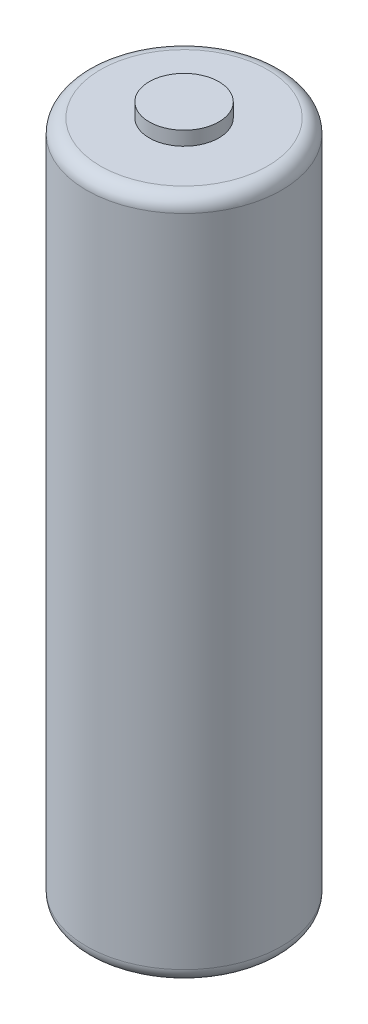
ISO-10303-21;
HEADER;
FILE_DESCRIPTION(('STEP AP214'),'2;1');
FILE_NAME('part.step','',(''),(''),'','','');
FILE_SCHEMA(('AUTOMOTIVE_DESIGN { 1 0 10303 214 1 1 1 1 }'));
ENDSEC;
DATA;
#1=APPLICATION_CONTEXT('core data for automotive mechanical design processes');
#2=APPLICATION_PROTOCOL_DEFINITION('international standard','automotive_design',2000,#1);
#3=PRODUCT_CONTEXT('',#1,'mechanical');
#4=PRODUCT('Part','Part','',(#3));
#5=PRODUCT_RELATED_PRODUCT_CATEGORY('part','',(#4));
#6=PRODUCT_DEFINITION_FORMATION('','',#4);
#7=PRODUCT_DEFINITION_CONTEXT('part definition',#1,'design');
#8=PRODUCT_DEFINITION('design','',#6,#7);
#9=PRODUCT_DEFINITION_SHAPE('','',#8);
#10=(LENGTH_UNIT() NAMED_UNIT(*) SI_UNIT(.MILLI.,.METRE.));
#11=(NAMED_UNIT(*) PLANE_ANGLE_UNIT() SI_UNIT($,.RADIAN.));
#12=(NAMED_UNIT(*) SI_UNIT($,.STERADIAN.) SOLID_ANGLE_UNIT());
#13=UNCERTAINTY_MEASURE_WITH_UNIT(LENGTH_MEASURE(1.E-05),#10,'distance_accuracy_value','');
#14=(GEOMETRIC_REPRESENTATION_CONTEXT(3) GLOBAL_UNCERTAINTY_ASSIGNED_CONTEXT((#13)) GLOBAL_UNIT_ASSIGNED_CONTEXT((#10,
#11,#12)) REPRESENTATION_CONTEXT('',''));
#15=CARTESIAN_POINT('',(0.,0.,0.));
#16=DIRECTION('',(0.,0.,1.));
#17=DIRECTION('',(1.,0.,0.));
#18=AXIS2_PLACEMENT_3D('',#15,#16,#17);
#19=CARTESIAN_POINT('',(0.,49.,0.));
#20=DIRECTION('',(0.,-1.,0.));
#21=DIRECTION('',(0.,0.,-1.));
#22=AXIS2_PLACEMENT_3D('',#19,#20,#21);
#23=CYLINDRICAL_SURFACE('',#22,7.);
#24=CARTESIAN_POINT('',(0.,1.,0.));
#25=DIRECTION('',(0.,1.,0.));
#26=DIRECTION('',(0.,0.,1.));
#27=AXIS2_PLACEMENT_3D('',#24,#25,#26);
#28=CIRCLE('',#27,7.);
#29=CARTESIAN_POINT('',(0.,1.,7.));
#30=VERTEX_POINT('',#29);
#31=EDGE_CURVE('E44',#30,#30,#28,.T.);
#32=ORIENTED_EDGE('',*,*,#31,.T.);
#33=EDGE_LOOP('',(#32));
#34=FACE_BOUND('',#33,.T.);
#35=CARTESIAN_POINT('',(0.,48.,0.));
#36=DIRECTION('',(0.,1.,0.));
#37=DIRECTION('',(0.,0.,1.));
#38=AXIS2_PLACEMENT_3D('',#35,#36,#37);
#39=CIRCLE('',#38,7.);
#40=CARTESIAN_POINT('',(0.,48.,7.));
#41=VERTEX_POINT('',#40);
#42=EDGE_CURVE('E48',#41,#41,#39,.F.);
#43=ORIENTED_EDGE('',*,*,#42,.T.);
#44=EDGE_LOOP('',(#43));
#45=FACE_BOUND('',#44,.T.);
#46=ADVANCED_FACE('F33',(#34,#45),#23,.T.);
#47=CARTESIAN_POINT('',(0.,49.,0.));
#48=DIRECTION('',(0.,1.,0.));
#49=DIRECTION('',(0.,0.,1.));
#50=AXIS2_PLACEMENT_3D('',#47,#48,#49);
#51=PLANE('',#50);
#52=CARTESIAN_POINT('',(0.,49.,0.));
#53=DIRECTION('',(0.,1.,0.));
#54=DIRECTION('',(0.,0.,1.));
#55=AXIS2_PLACEMENT_3D('',#52,#53,#54);
#56=CIRCLE('',#55,6.);
#57=CARTESIAN_POINT('',(0.,49.,6.));
#58=VERTEX_POINT('',#57);
#59=EDGE_CURVE('E10',#58,#58,#56,.T.);
#60=ORIENTED_EDGE('',*,*,#59,.T.);
#61=EDGE_LOOP('',(#60));
#62=FACE_BOUND('',#61,.T.);
#63=CARTESIAN_POINT('',(0.,49.,0.));
#64=DIRECTION('',(0.,1.,0.));
#65=DIRECTION('',(0.,0.,1.));
#66=AXIS2_PLACEMENT_3D('',#63,#64,#65);
#67=CIRCLE('',#66,2.5);
#68=CARTESIAN_POINT('',(0.,49.,2.5));
#69=VERTEX_POINT('',#68);
#70=EDGE_CURVE('E53',#69,#69,#67,.T.);
#71=ORIENTED_EDGE('',*,*,#70,.F.);
#72=EDGE_LOOP('',(#71));
#73=FACE_BOUND('',#72,.T.);
#74=ADVANCED_FACE('F69',(#62,#73),#51,.T.);
#75=CARTESIAN_POINT('',(0.,0.,0.));
#76=DIRECTION('',(0.,1.,0.));
#77=DIRECTION('',(0.,0.,1.));
#78=AXIS2_PLACEMENT_3D('',#75,#76,#77);
#79=PLANE('',#78);
#80=CARTESIAN_POINT('',(0.,0.,0.));
#81=DIRECTION('',(0.,1.,0.));
#82=DIRECTION('',(0.,0.,1.));
#83=AXIS2_PLACEMENT_3D('',#80,#81,#82);
#84=CIRCLE('',#83,6.);
#85=CARTESIAN_POINT('',(0.,0.,6.));
#86=VERTEX_POINT('',#85);
#87=EDGE_CURVE('E40',#86,#86,#84,.F.);
#88=ORIENTED_EDGE('',*,*,#87,.T.);
#89=EDGE_LOOP('',(#88));
#90=FACE_BOUND('',#89,.T.);
#91=ADVANCED_FACE('F65',(#90),#79,.F.);
#92=CARTESIAN_POINT('',(0.,50.,0.));
#93=DIRECTION('',(0.,-1.,0.));
#94=DIRECTION('',(0.,0.,-1.));
#95=AXIS2_PLACEMENT_3D('',#92,#93,#94);
#96=CYLINDRICAL_SURFACE('',#95,2.5);
#97=CARTESIAN_POINT('',(0.,50.,0.));
#98=DIRECTION('',(0.,1.,0.));
#99=DIRECTION('',(0.,0.,1.));
#100=AXIS2_PLACEMENT_3D('',#97,#98,#99);
#101=CIRCLE('',#100,2.5);
#102=CARTESIAN_POINT('',(0.,50.,2.5));
#103=VERTEX_POINT('',#102);
#104=EDGE_CURVE('E56',#103,#103,#101,.T.);
#105=ORIENTED_EDGE('',*,*,#104,.F.);
#106=EDGE_LOOP('',(#105));
#107=FACE_BOUND('',#106,.T.);
#108=ORIENTED_EDGE('',*,*,#70,.T.);
#109=EDGE_LOOP('',(#108));
#110=FACE_BOUND('',#109,.T.);
#111=ADVANCED_FACE('F62',(#107,#110),#96,.T.);
#112=CARTESIAN_POINT('',(0.,50.,0.));
#113=DIRECTION('',(0.,1.,0.));
#114=DIRECTION('',(0.,0.,1.));
#115=AXIS2_PLACEMENT_3D('',#112,#113,#114);
#116=PLANE('',#115);
#117=ORIENTED_EDGE('',*,*,#104,.T.);
#118=EDGE_LOOP('',(#117));
#119=FACE_BOUND('',#118,.T.);
#120=ADVANCED_FACE('F60',(#119),#116,.T.);
#121=CARTESIAN_POINT('',(0.,1.,0.));
#122=DIRECTION('',(0.,1.,0.));
#123=DIRECTION('',(0.,0.,1.));
#124=AXIS2_PLACEMENT_3D('',#121,#122,#123);
#125=TOROIDAL_SURFACE('',#124,6.,1.);
#126=ORIENTED_EDGE('',*,*,#87,.F.);
#127=EDGE_LOOP('',(#126));
#128=FACE_BOUND('',#127,.T.);
#129=ORIENTED_EDGE('',*,*,#31,.F.);
#130=EDGE_LOOP('',(#129));
#131=FACE_BOUND('',#130,.T.);
#132=ADVANCED_FACE('F80',(#128,#131),#125,.T.);
#133=CARTESIAN_POINT('',(0.,48.,0.));
#134=DIRECTION('',(0.,1.,0.));
#135=DIRECTION('',(0.,0.,1.));
#136=AXIS2_PLACEMENT_3D('',#133,#134,#135);
#137=TOROIDAL_SURFACE('',#136,6.,1.);
#138=ORIENTED_EDGE('',*,*,#42,.F.);
#139=EDGE_LOOP('',(#138));
#140=FACE_BOUND('',#139,.T.);
#141=ORIENTED_EDGE('',*,*,#59,.F.);
#142=EDGE_LOOP('',(#141));
#143=FACE_BOUND('',#142,.T.);
#144=ADVANCED_FACE('F35',(#140,#143),#137,.T.);
#145=CLOSED_SHELL('',(#46,#74,#91,#111,#120,#132,#144));
#146=MANIFOLD_SOLID_BREP('B2',#145);
#147=ADVANCED_BREP_SHAPE_REPRESENTATION('',(#18,#146),#14);
#148=SHAPE_DEFINITION_REPRESENTATION(#9,#147);
ENDSEC;
END-ISO-10303-21;
